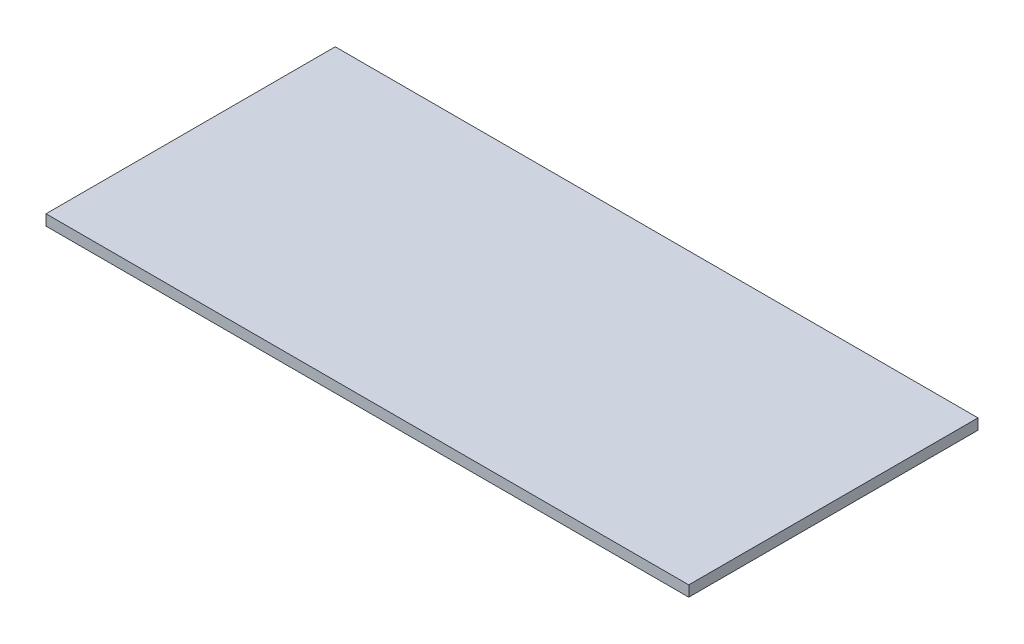
ISO-10303-21;
HEADER;
FILE_DESCRIPTION(('STEP AP214'),'2;1');
FILE_NAME('part.step','',(''),(''),'','','');
FILE_SCHEMA(('AUTOMOTIVE_DESIGN { 1 0 10303 214 1 1 1 1 }'));
ENDSEC;
DATA;
#1=APPLICATION_CONTEXT('core data for automotive mechanical design processes');
#2=APPLICATION_PROTOCOL_DEFINITION('international standard','automotive_design',2000,#1);
#3=PRODUCT_CONTEXT('',#1,'mechanical');
#4=PRODUCT('Part','Part','',(#3));
#5=PRODUCT_RELATED_PRODUCT_CATEGORY('part','',(#4));
#6=PRODUCT_DEFINITION_FORMATION('','',#4);
#7=PRODUCT_DEFINITION_CONTEXT('part definition',#1,'design');
#8=PRODUCT_DEFINITION('design','',#6,#7);
#9=PRODUCT_DEFINITION_SHAPE('','',#8);
#10=(LENGTH_UNIT() NAMED_UNIT(*) SI_UNIT(.MILLI.,.METRE.));
#11=(NAMED_UNIT(*) PLANE_ANGLE_UNIT() SI_UNIT($,.RADIAN.));
#12=(NAMED_UNIT(*) SI_UNIT($,.STERADIAN.) SOLID_ANGLE_UNIT());
#13=UNCERTAINTY_MEASURE_WITH_UNIT(LENGTH_MEASURE(1.E-05),#10,'distance_accuracy_value','');
#14=(GEOMETRIC_REPRESENTATION_CONTEXT(3) GLOBAL_UNCERTAINTY_ASSIGNED_CONTEXT((#13)) GLOBAL_UNIT_ASSIGNED_CONTEXT((#10,
#11,#12)) REPRESENTATION_CONTEXT('',''));
#15=CARTESIAN_POINT('',(0.,0.,0.));
#16=DIRECTION('',(0.,0.,1.));
#17=DIRECTION('',(1.,0.,0.));
#18=AXIS2_PLACEMENT_3D('',#15,#16,#17);
#19=CARTESIAN_POINT('',(0.,10.02,0.));
#20=DIRECTION('',(0.,-1.,0.));
#21=DIRECTION('',(0.,0.,-1.));
#22=AXIS2_PLACEMENT_3D('',#19,#20,#21);
#23=PLANE('',#22);
#24=DIRECTION('',(0.,0.,-1.));
#25=VECTOR('',#24,1.);
#26=CARTESIAN_POINT('',(-54.1,10.02,-15.45));
#27=LINE('',#26,#25);
#28=CARTESIAN_POINT('',(-54.1,10.02,-15.45));
#29=VERTEX_POINT('',#28);
#30=CARTESIAN_POINT('',(-54.1,10.02,-18.15));
#31=VERTEX_POINT('',#30);
#32=EDGE_CURVE('E11',#29,#31,#27,.T.);
#33=ORIENTED_EDGE('',*,*,#32,.T.);
#34=DIRECTION('',(1.,0.,0.));
#35=VECTOR('',#34,1.);
#36=CARTESIAN_POINT('',(-54.1,10.02,-18.15));
#37=LINE('',#36,#35);
#38=CARTESIAN_POINT('',(-48.1,10.02,-18.15));
#39=VERTEX_POINT('',#38);
#40=EDGE_CURVE('E43',#31,#39,#37,.T.);
#41=ORIENTED_EDGE('',*,*,#40,.T.);
#42=DIRECTION('',(0.,0.,1.));
#43=VECTOR('',#42,1.);
#44=CARTESIAN_POINT('',(-48.1,10.02,-18.15));
#45=LINE('',#44,#43);
#46=CARTESIAN_POINT('',(-48.1,10.02,-15.45));
#47=VERTEX_POINT('',#46);
#48=EDGE_CURVE('E76',#39,#47,#45,.T.);
#49=ORIENTED_EDGE('',*,*,#48,.T.);
#50=DIRECTION('',(-1.,0.,0.));
#51=VECTOR('',#50,1.);
#52=CARTESIAN_POINT('',(-48.1,10.02,-15.45));
#53=LINE('',#52,#51);
#54=EDGE_CURVE('E104',#47,#29,#53,.T.);
#55=ORIENTED_EDGE('',*,*,#54,.T.);
#56=EDGE_LOOP('',(#33,#41,#49,#55));
#57=FACE_BOUND('',#56,.T.);
#58=ADVANCED_FACE('F17',(#57),#23,.T.);
#59=CARTESIAN_POINT('',(-54.1,10.12,-15.45));
#60=DIRECTION('',(-1.,0.,0.));
#61=DIRECTION('',(0.,0.,1.));
#62=AXIS2_PLACEMENT_3D('',#59,#60,#61);
#63=PLANE('',#62);
#64=DIRECTION('',(0.,-1.,0.));
#65=VECTOR('',#64,1.);
#66=CARTESIAN_POINT('',(-54.1,10.12,-18.15));
#67=LINE('',#66,#65);
#68=CARTESIAN_POINT('',(-54.1,10.12,-18.15));
#69=VERTEX_POINT('',#68);
#70=EDGE_CURVE('E20',#69,#31,#67,.T.);
#71=ORIENTED_EDGE('',*,*,#70,.T.);
#72=ORIENTED_EDGE('',*,*,#32,.F.);
#73=DIRECTION('',(0.,-1.,0.));
#74=VECTOR('',#73,1.);
#75=CARTESIAN_POINT('',(-54.1,10.12,-15.45));
#76=LINE('',#75,#74);
#77=CARTESIAN_POINT('',(-54.1,10.12,-15.45));
#78=VERTEX_POINT('',#77);
#79=EDGE_CURVE('E105',#78,#29,#76,.T.);
#80=ORIENTED_EDGE('',*,*,#79,.F.);
#81=DIRECTION('',(0.,0.,-1.));
#82=VECTOR('',#81,1.);
#83=CARTESIAN_POINT('',(-54.1,10.12,-15.45));
#84=LINE('',#83,#82);
#85=EDGE_CURVE('E87',#78,#69,#84,.T.);
#86=ORIENTED_EDGE('',*,*,#85,.T.);
#87=EDGE_LOOP('',(#71,#72,#80,#86));
#88=FACE_BOUND('',#87,.T.);
#89=ADVANCED_FACE('F118',(#88),#63,.T.);
#90=CARTESIAN_POINT('',(-54.1,10.12,-18.15));
#91=DIRECTION('',(0.,0.,-1.));
#92=DIRECTION('',(0.,-1.,0.));
#93=AXIS2_PLACEMENT_3D('',#90,#91,#92);
#94=PLANE('',#93);
#95=DIRECTION('',(0.,-1.,0.));
#96=VECTOR('',#95,1.);
#97=CARTESIAN_POINT('',(-48.1,10.12,-18.15));
#98=LINE('',#97,#96);
#99=CARTESIAN_POINT('',(-48.1,10.12,-18.15));
#100=VERTEX_POINT('',#99);
#101=EDGE_CURVE('E70',#100,#39,#98,.T.);
#102=ORIENTED_EDGE('',*,*,#101,.T.);
#103=ORIENTED_EDGE('',*,*,#40,.F.);
#104=ORIENTED_EDGE('',*,*,#70,.F.);
#105=DIRECTION('',(1.,0.,0.));
#106=VECTOR('',#105,1.);
#107=CARTESIAN_POINT('',(-54.1,10.12,-18.15));
#108=LINE('',#107,#106);
#109=EDGE_CURVE('E81',#69,#100,#108,.T.);
#110=ORIENTED_EDGE('',*,*,#109,.T.);
#111=EDGE_LOOP('',(#102,#103,#104,#110));
#112=FACE_BOUND('',#111,.T.);
#113=ADVANCED_FACE('F82',(#112),#94,.T.);
#114=CARTESIAN_POINT('',(-48.1,10.12,-18.15));
#115=DIRECTION('',(1.,0.,0.));
#116=DIRECTION('',(0.,1.,0.));
#117=AXIS2_PLACEMENT_3D('',#114,#115,#116);
#118=PLANE('',#117);
#119=DIRECTION('',(0.,-1.,0.));
#120=VECTOR('',#119,1.);
#121=CARTESIAN_POINT('',(-48.1,10.12,-15.45));
#122=LINE('',#121,#120);
#123=CARTESIAN_POINT('',(-48.1,10.12,-15.45));
#124=VERTEX_POINT('',#123);
#125=EDGE_CURVE('E101',#124,#47,#122,.T.);
#126=ORIENTED_EDGE('',*,*,#125,.T.);
#127=ORIENTED_EDGE('',*,*,#48,.F.);
#128=ORIENTED_EDGE('',*,*,#101,.F.);
#129=DIRECTION('',(0.,0.,1.));
#130=VECTOR('',#129,1.);
#131=CARTESIAN_POINT('',(-48.1,10.12,-18.15));
#132=LINE('',#131,#130);
#133=EDGE_CURVE('E75',#100,#124,#132,.T.);
#134=ORIENTED_EDGE('',*,*,#133,.T.);
#135=EDGE_LOOP('',(#126,#127,#128,#134));
#136=FACE_BOUND('',#135,.T.);
#137=ADVANCED_FACE('F73',(#136),#118,.T.);
#138=CARTESIAN_POINT('',(-48.1,10.12,-15.45));
#139=DIRECTION('',(0.,0.,1.));
#140=DIRECTION('',(1.,0.,0.));
#141=AXIS2_PLACEMENT_3D('',#138,#139,#140);
#142=PLANE('',#141);
#143=ORIENTED_EDGE('',*,*,#79,.T.);
#144=ORIENTED_EDGE('',*,*,#54,.F.);
#145=ORIENTED_EDGE('',*,*,#125,.F.);
#146=DIRECTION('',(-1.,0.,0.));
#147=VECTOR('',#146,1.);
#148=CARTESIAN_POINT('',(-48.1,10.12,-15.45));
#149=LINE('',#148,#147);
#150=EDGE_CURVE('E92',#124,#78,#149,.T.);
#151=ORIENTED_EDGE('',*,*,#150,.T.);
#152=EDGE_LOOP('',(#143,#144,#145,#151));
#153=FACE_BOUND('',#152,.T.);
#154=ADVANCED_FACE('F121',(#153),#142,.T.);
#155=CARTESIAN_POINT('',(0.,10.12,0.));
#156=DIRECTION('',(0.,-1.,0.));
#157=DIRECTION('',(0.,0.,-1.));
#158=AXIS2_PLACEMENT_3D('',#155,#156,#157);
#159=PLANE('',#158);
#160=ORIENTED_EDGE('',*,*,#133,.F.);
#161=ORIENTED_EDGE('',*,*,#109,.F.);
#162=ORIENTED_EDGE('',*,*,#85,.F.);
#163=ORIENTED_EDGE('',*,*,#150,.F.);
#164=EDGE_LOOP('',(#160,#161,#162,#163));
#165=FACE_BOUND('',#164,.T.);
#166=ADVANCED_FACE('F90',(#165),#159,.F.);
#167=CLOSED_SHELL('',(#58,#89,#113,#137,#154,#166));
#168=MANIFOLD_SOLID_BREP('B1',#167);
#169=ADVANCED_BREP_SHAPE_REPRESENTATION('',(#18,#168),#14);
#170=SHAPE_DEFINITION_REPRESENTATION(#9,#169);
ENDSEC;
END-ISO-10303-21;
